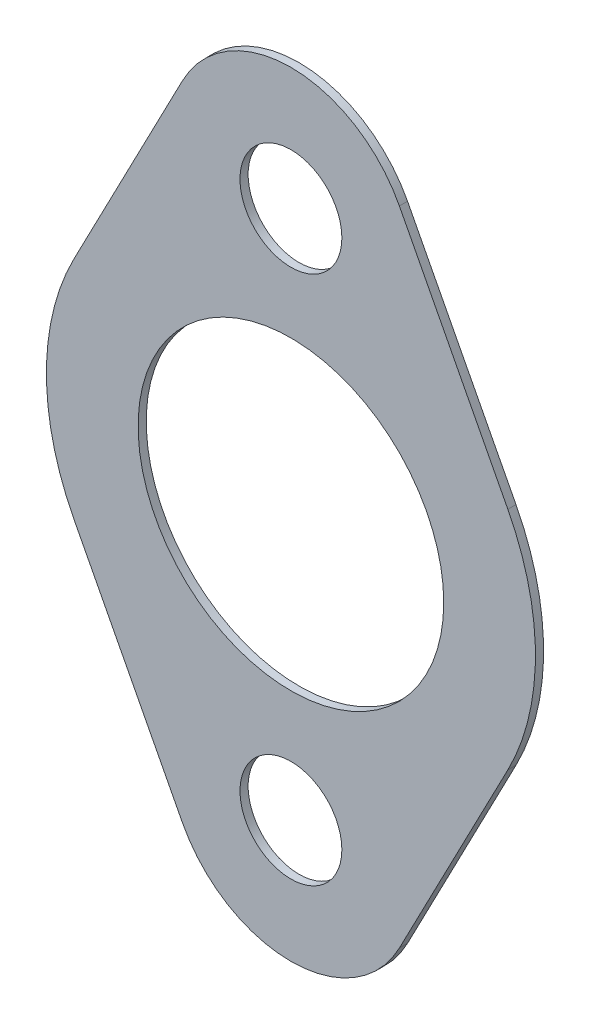
ISO-10303-21;
HEADER;
FILE_DESCRIPTION(('STEP AP214'),'2;1');
FILE_NAME('part.step','',(''),(''),'','','');
FILE_SCHEMA(('AUTOMOTIVE_DESIGN { 1 0 10303 214 1 1 1 1 }'));
ENDSEC;
DATA;
#1=APPLICATION_CONTEXT('core data for automotive mechanical design processes');
#2=APPLICATION_PROTOCOL_DEFINITION('international standard','automotive_design',2000,#1);
#3=PRODUCT_CONTEXT('',#1,'mechanical');
#4=PRODUCT('Part','Part','',(#3));
#5=PRODUCT_RELATED_PRODUCT_CATEGORY('part','',(#4));
#6=PRODUCT_DEFINITION_FORMATION('','',#4);
#7=PRODUCT_DEFINITION_CONTEXT('part definition',#1,'design');
#8=PRODUCT_DEFINITION('design','',#6,#7);
#9=PRODUCT_DEFINITION_SHAPE('','',#8);
#10=(LENGTH_UNIT() NAMED_UNIT(*) SI_UNIT(.MILLI.,.METRE.));
#11=(NAMED_UNIT(*) PLANE_ANGLE_UNIT() SI_UNIT($,.RADIAN.));
#12=(NAMED_UNIT(*) SI_UNIT($,.STERADIAN.) SOLID_ANGLE_UNIT());
#13=UNCERTAINTY_MEASURE_WITH_UNIT(LENGTH_MEASURE(1.E-05),#10,'distance_accuracy_value','');
#14=(GEOMETRIC_REPRESENTATION_CONTEXT(3) GLOBAL_UNCERTAINTY_ASSIGNED_CONTEXT((#13)) GLOBAL_UNIT_ASSIGNED_CONTEXT((#10,
#11,#12)) REPRESENTATION_CONTEXT('',''));
#15=CARTESIAN_POINT('',(0.,0.,0.));
#16=DIRECTION('',(0.,0.,1.));
#17=DIRECTION('',(1.,0.,0.));
#18=AXIS2_PLACEMENT_3D('',#15,#16,#17);
#19=CARTESIAN_POINT('',(0.,65.,2.));
#20=DIRECTION('',(0.,0.,-1.));
#21=DIRECTION('',(-1.,0.,0.));
#22=AXIS2_PLACEMENT_3D('',#19,#20,#21);
#23=CYLINDRICAL_SURFACE('',#22,30.);
#24=CARTESIAN_POINT('',(0.,65.,0.));
#25=DIRECTION('',(0.,0.,-1.));
#26=DIRECTION('',(-1.,0.,0.));
#27=AXIS2_PLACEMENT_3D('',#24,#25,#26);
#28=CIRCLE('',#27,30.);
#29=CARTESIAN_POINT('',(-26.6136059877018,78.8461538461538,0.));
#30=VERTEX_POINT('',#29);
#31=CARTESIAN_POINT('',(26.6136059877019,78.8461538461539,0.));
#32=VERTEX_POINT('',#31);
#33=EDGE_CURVE('E129',#30,#32,#28,.T.);
#34=ORIENTED_EDGE('',*,*,#33,.F.);
#35=DIRECTION('',(0.,0.,-1.));
#36=VECTOR('',#35,1.);
#37=CARTESIAN_POINT('',(-26.6136059877018,78.8461538461538,2.));
#38=LINE('',#37,#36);
#39=CARTESIAN_POINT('',(-26.6136059877018,78.8461538461538,2.));
#40=VERTEX_POINT('',#39);
#41=EDGE_CURVE('E11',#40,#30,#38,.T.);
#42=ORIENTED_EDGE('',*,*,#41,.F.);
#43=CARTESIAN_POINT('',(0.,65.,2.));
#44=DIRECTION('',(0.,0.,-1.));
#45=DIRECTION('',(-1.,0.,0.));
#46=AXIS2_PLACEMENT_3D('',#43,#44,#45);
#47=CIRCLE('',#46,30.);
#48=CARTESIAN_POINT('',(26.6136059877019,78.8461538461539,2.));
#49=VERTEX_POINT('',#48);
#50=EDGE_CURVE('E148',#40,#49,#47,.T.);
#51=ORIENTED_EDGE('',*,*,#50,.T.);
#52=DIRECTION('',(0.,0.,-1.));
#53=VECTOR('',#52,1.);
#54=CARTESIAN_POINT('',(26.6136059877019,78.8461538461539,2.));
#55=LINE('',#54,#53);
#56=EDGE_CURVE('E35',#49,#32,#55,.T.);
#57=ORIENTED_EDGE('',*,*,#56,.T.);
#58=EDGE_LOOP('',(#34,#42,#51,#57));
#59=FACE_BOUND('',#58,.T.);
#60=ADVANCED_FACE('F32',(#59),#23,.T.);
#61=CARTESIAN_POINT('',(-26.6136059877018,78.8461538461538,2.));
#62=DIRECTION('',(0.887120199590061,-0.461538461538462,0.));
#63=DIRECTION('',(0.461538461538462,0.887120199590061,0.));
#64=AXIS2_PLACEMENT_3D('',#61,#62,#63);
#65=PLANE('',#64);
#66=DIRECTION('',(-0.461538461538462,-0.887120199590061,0.));
#67=VECTOR('',#66,1.);
#68=CARTESIAN_POINT('',(-26.6136059877018,78.8461538461538,0.));
#69=LINE('',#68,#67);
#70=CARTESIAN_POINT('',(-53.2272119754037,27.6923076923077,0.));
#71=VERTEX_POINT('',#70);
#72=EDGE_CURVE('E147',#30,#71,#69,.T.);
#73=ORIENTED_EDGE('',*,*,#72,.T.);
#74=DIRECTION('',(0.,0.,-1.));
#75=VECTOR('',#74,1.);
#76=CARTESIAN_POINT('',(-53.2272119754037,27.6923076923077,2.));
#77=LINE('',#76,#75);
#78=CARTESIAN_POINT('',(-53.2272119754037,27.6923076923077,2.));
#79=VERTEX_POINT('',#78);
#80=EDGE_CURVE('E41',#79,#71,#77,.T.);
#81=ORIENTED_EDGE('',*,*,#80,.F.);
#82=DIRECTION('',(-0.461538461538462,-0.887120199590061,0.));
#83=VECTOR('',#82,1.);
#84=CARTESIAN_POINT('',(-26.6136059877018,78.8461538461538,2.));
#85=LINE('',#84,#83);
#86=EDGE_CURVE('E118',#40,#79,#85,.T.);
#87=ORIENTED_EDGE('',*,*,#86,.F.);
#88=ORIENTED_EDGE('',*,*,#41,.T.);
#89=EDGE_LOOP('',(#73,#81,#87,#88));
#90=FACE_BOUND('',#89,.T.);
#91=ADVANCED_FACE('F161',(#90),#65,.F.);
#92=CARTESIAN_POINT('',(0.,0.,2.));
#93=DIRECTION('',(0.,0.,-1.));
#94=DIRECTION('',(-1.,0.,0.));
#95=AXIS2_PLACEMENT_3D('',#92,#93,#94);
#96=CYLINDRICAL_SURFACE('',#95,60.);
#97=CARTESIAN_POINT('',(0.,0.,0.));
#98=DIRECTION('',(0.,0.,-1.));
#99=DIRECTION('',(-1.,0.,0.));
#100=AXIS2_PLACEMENT_3D('',#97,#98,#99);
#101=CIRCLE('',#100,60.);
#102=CARTESIAN_POINT('',(-53.2272119754037,-27.6923076923077,0.));
#103=VERTEX_POINT('',#102);
#104=EDGE_CURVE('E106',#103,#71,#101,.T.);
#105=ORIENTED_EDGE('',*,*,#104,.F.);
#106=DIRECTION('',(0.,0.,-1.));
#107=VECTOR('',#106,1.);
#108=CARTESIAN_POINT('',(-53.2272119754037,-27.6923076923077,2.));
#109=LINE('',#108,#107);
#110=CARTESIAN_POINT('',(-53.2272119754037,-27.6923076923077,2.));
#111=VERTEX_POINT('',#110);
#112=EDGE_CURVE('E101',#111,#103,#109,.T.);
#113=ORIENTED_EDGE('',*,*,#112,.F.);
#114=CARTESIAN_POINT('',(0.,0.,2.));
#115=DIRECTION('',(0.,0.,-1.));
#116=DIRECTION('',(-1.,0.,0.));
#117=AXIS2_PLACEMENT_3D('',#114,#115,#116);
#118=CIRCLE('',#117,60.);
#119=EDGE_CURVE('E104',#111,#79,#118,.T.);
#120=ORIENTED_EDGE('',*,*,#119,.T.);
#121=ORIENTED_EDGE('',*,*,#80,.T.);
#122=EDGE_LOOP('',(#105,#113,#120,#121));
#123=FACE_BOUND('',#122,.T.);
#124=ADVANCED_FACE('F103',(#123),#96,.T.);
#125=CARTESIAN_POINT('',(-26.6136059877018,-78.8461538461538,2.));
#126=DIRECTION('',(-0.887120199590061,-0.461538461538462,0.));
#127=DIRECTION('',(0.461538461538462,-0.887120199590061,0.));
#128=AXIS2_PLACEMENT_3D('',#125,#126,#127);
#129=PLANE('',#128);
#130=DIRECTION('',(-0.461538461538462,0.887120199590061,0.));
#131=VECTOR('',#130,1.);
#132=CARTESIAN_POINT('',(-26.6136059877018,-78.8461538461538,0.));
#133=LINE('',#132,#131);
#134=CARTESIAN_POINT('',(-26.6136059877018,-78.8461538461538,0.));
#135=VERTEX_POINT('',#134);
#136=EDGE_CURVE('E144',#135,#103,#133,.T.);
#137=ORIENTED_EDGE('',*,*,#136,.F.);
#138=DIRECTION('',(0.,0.,-1.));
#139=VECTOR('',#138,1.);
#140=CARTESIAN_POINT('',(-26.6136059877018,-78.8461538461538,2.));
#141=LINE('',#140,#139);
#142=CARTESIAN_POINT('',(-26.6136059877018,-78.8461538461538,2.));
#143=VERTEX_POINT('',#142);
#144=EDGE_CURVE('E111',#143,#135,#141,.T.);
#145=ORIENTED_EDGE('',*,*,#144,.F.);
#146=DIRECTION('',(-0.461538461538462,0.887120199590061,0.));
#147=VECTOR('',#146,1.);
#148=CARTESIAN_POINT('',(-26.6136059877018,-78.8461538461538,2.));
#149=LINE('',#148,#147);
#150=EDGE_CURVE('E117',#143,#111,#149,.T.);
#151=ORIENTED_EDGE('',*,*,#150,.T.);
#152=ORIENTED_EDGE('',*,*,#112,.T.);
#153=EDGE_LOOP('',(#137,#145,#151,#152));
#154=FACE_BOUND('',#153,.T.);
#155=ADVANCED_FACE('F120',(#154),#129,.T.);
#156=CARTESIAN_POINT('',(0.,-65.,2.));
#157=DIRECTION('',(0.,0.,-1.));
#158=DIRECTION('',(-1.,0.,0.));
#159=AXIS2_PLACEMENT_3D('',#156,#157,#158);
#160=CYLINDRICAL_SURFACE('',#159,30.);
#161=CARTESIAN_POINT('',(0.,-65.,0.));
#162=DIRECTION('',(0.,0.,1.));
#163=DIRECTION('',(1.,0.,0.));
#164=AXIS2_PLACEMENT_3D('',#161,#162,#163);
#165=CIRCLE('',#164,30.);
#166=CARTESIAN_POINT('',(26.6136059877018,-78.8461538461539,0.));
#167=VERTEX_POINT('',#166);
#168=EDGE_CURVE('E142',#135,#167,#165,.T.);
#169=ORIENTED_EDGE('',*,*,#168,.T.);
#170=DIRECTION('',(0.,0.,-1.));
#171=VECTOR('',#170,1.);
#172=CARTESIAN_POINT('',(26.6136059877018,-78.8461538461539,2.));
#173=LINE('',#172,#171);
#174=CARTESIAN_POINT('',(26.6136059877018,-78.8461538461539,2.));
#175=VERTEX_POINT('',#174);
#176=EDGE_CURVE('E152',#175,#167,#173,.T.);
#177=ORIENTED_EDGE('',*,*,#176,.F.);
#178=CARTESIAN_POINT('',(0.,-65.,2.));
#179=DIRECTION('',(0.,0.,1.));
#180=DIRECTION('',(1.,0.,0.));
#181=AXIS2_PLACEMENT_3D('',#178,#179,#180);
#182=CIRCLE('',#181,30.);
#183=EDGE_CURVE('E122',#143,#175,#182,.T.);
#184=ORIENTED_EDGE('',*,*,#183,.F.);
#185=ORIENTED_EDGE('',*,*,#144,.T.);
#186=EDGE_LOOP('',(#169,#177,#184,#185));
#187=FACE_BOUND('',#186,.T.);
#188=ADVANCED_FACE('F182',(#187),#160,.T.);
#189=CARTESIAN_POINT('',(26.6136059877019,-78.8461538461539,2.));
#190=DIRECTION('',(-0.887120199590062,0.461538461538461,0.));
#191=DIRECTION('',(-0.461538461538461,-0.887120199590062,0.));
#192=AXIS2_PLACEMENT_3D('',#189,#190,#191);
#193=PLANE('',#192);
#194=DIRECTION('',(0.46153846153846,0.887120199590062,0.));
#195=VECTOR('',#194,1.);
#196=CARTESIAN_POINT('',(26.6136059877019,-78.8461538461539,0.));
#197=LINE('',#196,#195);
#198=CARTESIAN_POINT('',(53.2272119754036,-27.6923076923077,0.));
#199=VERTEX_POINT('',#198);
#200=EDGE_CURVE('E139',#167,#199,#197,.T.);
#201=ORIENTED_EDGE('',*,*,#200,.T.);
#202=DIRECTION('',(0.,0.,-1.));
#203=VECTOR('',#202,1.);
#204=CARTESIAN_POINT('',(53.2272119754036,-27.6923076923077,2.));
#205=LINE('',#204,#203);
#206=CARTESIAN_POINT('',(53.2272119754036,-27.6923076923077,2.));
#207=VERTEX_POINT('',#206);
#208=EDGE_CURVE('E155',#207,#199,#205,.T.);
#209=ORIENTED_EDGE('',*,*,#208,.F.);
#210=DIRECTION('',(0.46153846153846,0.887120199590062,0.));
#211=VECTOR('',#210,1.);
#212=CARTESIAN_POINT('',(26.6136059877019,-78.8461538461539,2.));
#213=LINE('',#212,#211);
#214=EDGE_CURVE('E124',#175,#207,#213,.T.);
#215=ORIENTED_EDGE('',*,*,#214,.F.);
#216=ORIENTED_EDGE('',*,*,#176,.T.);
#217=EDGE_LOOP('',(#201,#209,#215,#216));
#218=FACE_BOUND('',#217,.T.);
#219=ADVANCED_FACE('F176',(#218),#193,.F.);
#220=CARTESIAN_POINT('',(0.,0.,2.));
#221=DIRECTION('',(0.,0.,-1.));
#222=DIRECTION('',(-1.,0.,0.));
#223=AXIS2_PLACEMENT_3D('',#220,#221,#222);
#224=CYLINDRICAL_SURFACE('',#223,60.);
#225=CARTESIAN_POINT('',(0.,0.,0.));
#226=DIRECTION('',(0.,0.,-1.));
#227=DIRECTION('',(-1.,0.,0.));
#228=AXIS2_PLACEMENT_3D('',#225,#226,#227);
#229=CIRCLE('',#228,60.);
#230=CARTESIAN_POINT('',(53.2272119754036,27.6923076923077,0.));
#231=VERTEX_POINT('',#230);
#232=EDGE_CURVE('E136',#231,#199,#229,.T.);
#233=ORIENTED_EDGE('',*,*,#232,.F.);
#234=DIRECTION('',(0.,0.,-1.));
#235=VECTOR('',#234,1.);
#236=CARTESIAN_POINT('',(53.2272119754036,27.6923076923077,2.));
#237=LINE('',#236,#235);
#238=CARTESIAN_POINT('',(53.2272119754036,27.6923076923077,2.));
#239=VERTEX_POINT('',#238);
#240=EDGE_CURVE('E156',#239,#231,#237,.T.);
#241=ORIENTED_EDGE('',*,*,#240,.F.);
#242=CARTESIAN_POINT('',(0.,0.,2.));
#243=DIRECTION('',(0.,0.,-1.));
#244=DIRECTION('',(-1.,0.,0.));
#245=AXIS2_PLACEMENT_3D('',#242,#243,#244);
#246=CIRCLE('',#245,60.);
#247=EDGE_CURVE('E165',#239,#207,#246,.T.);
#248=ORIENTED_EDGE('',*,*,#247,.T.);
#249=ORIENTED_EDGE('',*,*,#208,.T.);
#250=EDGE_LOOP('',(#233,#241,#248,#249));
#251=FACE_BOUND('',#250,.T.);
#252=ADVANCED_FACE('F179',(#251),#224,.T.);
#253=CARTESIAN_POINT('',(26.6136059877019,78.8461538461539,2.));
#254=DIRECTION('',(0.887120199590062,0.461538461538461,0.));
#255=DIRECTION('',(-0.461538461538461,0.887120199590062,0.));
#256=AXIS2_PLACEMENT_3D('',#253,#254,#255);
#257=PLANE('',#256);
#258=DIRECTION('',(0.46153846153846,-0.887120199590062,0.));
#259=VECTOR('',#258,1.);
#260=CARTESIAN_POINT('',(26.6136059877019,78.8461538461539,0.));
#261=LINE('',#260,#259);
#262=EDGE_CURVE('E132',#32,#231,#261,.T.);
#263=ORIENTED_EDGE('',*,*,#262,.F.);
#264=ORIENTED_EDGE('',*,*,#56,.F.);
#265=DIRECTION('',(0.46153846153846,-0.887120199590062,0.));
#266=VECTOR('',#265,1.);
#267=CARTESIAN_POINT('',(26.6136059877019,78.8461538461539,2.));
#268=LINE('',#267,#266);
#269=EDGE_CURVE('E163',#49,#239,#268,.T.);
#270=ORIENTED_EDGE('',*,*,#269,.T.);
#271=ORIENTED_EDGE('',*,*,#240,.T.);
#272=EDGE_LOOP('',(#263,#264,#270,#271));
#273=FACE_BOUND('',#272,.T.);
#274=ADVANCED_FACE('F158',(#273),#257,.T.);
#275=CARTESIAN_POINT('',(0.,65.,2.));
#276=DIRECTION('',(0.,0.,-1.));
#277=DIRECTION('',(-1.,0.,0.));
#278=AXIS2_PLACEMENT_3D('',#275,#276,#277);
#279=PLANE('',#278);
#280=CARTESIAN_POINT('',(0.,0.,2.));
#281=DIRECTION('',(0.,0.,1.));
#282=DIRECTION('',(1.,0.,0.));
#283=AXIS2_PLACEMENT_3D('',#280,#281,#282);
#284=CIRCLE('',#283,37.5);
#285=CARTESIAN_POINT('',(37.5,0.,2.));
#286=VERTEX_POINT('',#285);
#287=EDGE_CURVE('E226',#286,#286,#284,.T.);
#288=ORIENTED_EDGE('',*,*,#287,.F.);
#289=EDGE_LOOP('',(#288));
#290=FACE_BOUND('',#289,.T.);
#291=CARTESIAN_POINT('',(0.,-65.,2.));
#292=DIRECTION('',(0.,0.,1.));
#293=DIRECTION('',(1.,0.,0.));
#294=AXIS2_PLACEMENT_3D('',#291,#292,#293);
#295=CIRCLE('',#294,12.5);
#296=CARTESIAN_POINT('',(12.5,-65.,2.));
#297=VERTEX_POINT('',#296);
#298=EDGE_CURVE('E228',#297,#297,#295,.T.);
#299=ORIENTED_EDGE('',*,*,#298,.F.);
#300=EDGE_LOOP('',(#299));
#301=FACE_BOUND('',#300,.T.);
#302=CARTESIAN_POINT('',(0.,65.,2.));
#303=DIRECTION('',(0.,0.,1.));
#304=DIRECTION('',(1.,0.,0.));
#305=AXIS2_PLACEMENT_3D('',#302,#303,#304);
#306=CIRCLE('',#305,12.5);
#307=CARTESIAN_POINT('',(12.5,65.,2.));
#308=VERTEX_POINT('',#307);
#309=EDGE_CURVE('E168',#308,#308,#306,.T.);
#310=ORIENTED_EDGE('',*,*,#309,.F.);
#311=EDGE_LOOP('',(#310));
#312=FACE_BOUND('',#311,.T.);
#313=ORIENTED_EDGE('',*,*,#50,.F.);
#314=ORIENTED_EDGE('',*,*,#86,.T.);
#315=ORIENTED_EDGE('',*,*,#119,.F.);
#316=ORIENTED_EDGE('',*,*,#150,.F.);
#317=ORIENTED_EDGE('',*,*,#183,.T.);
#318=ORIENTED_EDGE('',*,*,#214,.T.);
#319=ORIENTED_EDGE('',*,*,#247,.F.);
#320=ORIENTED_EDGE('',*,*,#269,.F.);
#321=EDGE_LOOP('',(#313,#314,#315,#316,#317,#318,#319,#320));
#322=FACE_BOUND('',#321,.T.);
#323=ADVANCED_FACE('F116',(#290,#301,#312,#322),#279,.F.);
#324=CARTESIAN_POINT('',(0.,65.,0.));
#325=DIRECTION('',(0.,0.,-1.));
#326=DIRECTION('',(-1.,0.,0.));
#327=AXIS2_PLACEMENT_3D('',#324,#325,#326);
#328=PLANE('',#327);
#329=CARTESIAN_POINT('',(0.,0.,0.));
#330=DIRECTION('',(0.,0.,1.));
#331=DIRECTION('',(1.,0.,0.));
#332=AXIS2_PLACEMENT_3D('',#329,#330,#331);
#333=CIRCLE('',#332,37.5);
#334=CARTESIAN_POINT('',(37.5,0.,0.));
#335=VERTEX_POINT('',#334);
#336=EDGE_CURVE('E223',#335,#335,#333,.T.);
#337=ORIENTED_EDGE('',*,*,#336,.T.);
#338=EDGE_LOOP('',(#337));
#339=FACE_BOUND('',#338,.T.);
#340=CARTESIAN_POINT('',(0.,-65.,0.));
#341=DIRECTION('',(0.,0.,1.));
#342=DIRECTION('',(1.,0.,0.));
#343=AXIS2_PLACEMENT_3D('',#340,#341,#342);
#344=CIRCLE('',#343,12.5);
#345=CARTESIAN_POINT('',(12.5,-65.,0.));
#346=VERTEX_POINT('',#345);
#347=EDGE_CURVE('E231',#346,#346,#344,.T.);
#348=ORIENTED_EDGE('',*,*,#347,.T.);
#349=EDGE_LOOP('',(#348));
#350=FACE_BOUND('',#349,.T.);
#351=CARTESIAN_POINT('',(0.,65.,0.));
#352=DIRECTION('',(0.,0.,1.));
#353=DIRECTION('',(1.,0.,0.));
#354=AXIS2_PLACEMENT_3D('',#351,#352,#353);
#355=CIRCLE('',#354,12.5);
#356=CARTESIAN_POINT('',(12.5,65.,0.));
#357=VERTEX_POINT('',#356);
#358=EDGE_CURVE('E133',#357,#357,#355,.T.);
#359=ORIENTED_EDGE('',*,*,#358,.T.);
#360=EDGE_LOOP('',(#359));
#361=FACE_BOUND('',#360,.T.);
#362=ORIENTED_EDGE('',*,*,#33,.T.);
#363=ORIENTED_EDGE('',*,*,#262,.T.);
#364=ORIENTED_EDGE('',*,*,#232,.T.);
#365=ORIENTED_EDGE('',*,*,#200,.F.);
#366=ORIENTED_EDGE('',*,*,#168,.F.);
#367=ORIENTED_EDGE('',*,*,#136,.T.);
#368=ORIENTED_EDGE('',*,*,#104,.T.);
#369=ORIENTED_EDGE('',*,*,#72,.F.);
#370=EDGE_LOOP('',(#362,#363,#364,#365,#366,#367,#368,#369));
#371=FACE_BOUND('',#370,.T.);
#372=ADVANCED_FACE('F160',(#339,#350,#361,#371),#328,.T.);
#373=CARTESIAN_POINT('',(0.,65.,0.));
#374=DIRECTION('',(0.,0.,1.));
#375=DIRECTION('',(1.,0.,0.));
#376=AXIS2_PLACEMENT_3D('',#373,#374,#375);
#377=CYLINDRICAL_SURFACE('',#376,12.5);
#378=ORIENTED_EDGE('',*,*,#358,.F.);
#379=EDGE_LOOP('',(#378));
#380=FACE_BOUND('',#379,.T.);
#381=ORIENTED_EDGE('',*,*,#309,.T.);
#382=EDGE_LOOP('',(#381));
#383=FACE_BOUND('',#382,.T.);
#384=ADVANCED_FACE('F203',(#380,#383),#377,.F.);
#385=CARTESIAN_POINT('',(0.,-65.,0.));
#386=DIRECTION('',(0.,0.,1.));
#387=DIRECTION('',(1.,0.,0.));
#388=AXIS2_PLACEMENT_3D('',#385,#386,#387);
#389=CYLINDRICAL_SURFACE('',#388,12.5);
#390=ORIENTED_EDGE('',*,*,#347,.F.);
#391=EDGE_LOOP('',(#390));
#392=FACE_BOUND('',#391,.T.);
#393=ORIENTED_EDGE('',*,*,#298,.T.);
#394=EDGE_LOOP('',(#393));
#395=FACE_BOUND('',#394,.T.);
#396=ADVANCED_FACE('F210',(#392,#395),#389,.F.);
#397=CARTESIAN_POINT('',(0.,0.,0.));
#398=DIRECTION('',(0.,0.,1.));
#399=DIRECTION('',(1.,0.,0.));
#400=AXIS2_PLACEMENT_3D('',#397,#398,#399);
#401=CYLINDRICAL_SURFACE('',#400,37.5);
#402=ORIENTED_EDGE('',*,*,#336,.F.);
#403=EDGE_LOOP('',(#402));
#404=FACE_BOUND('',#403,.T.);
#405=ORIENTED_EDGE('',*,*,#287,.T.);
#406=EDGE_LOOP('',(#405));
#407=FACE_BOUND('',#406,.T.);
#408=ADVANCED_FACE('F214',(#404,#407),#401,.F.);
#409=CLOSED_SHELL('',(#60,#91,#124,#155,#188,#219,#252,#274,#323,#372,#384,#396,#408));
#410=MANIFOLD_SOLID_BREP('B2',#409);
#411=ADVANCED_BREP_SHAPE_REPRESENTATION('',(#18,#410),#14);
#412=SHAPE_DEFINITION_REPRESENTATION(#9,#411);
ENDSEC;
END-ISO-10303-21;
